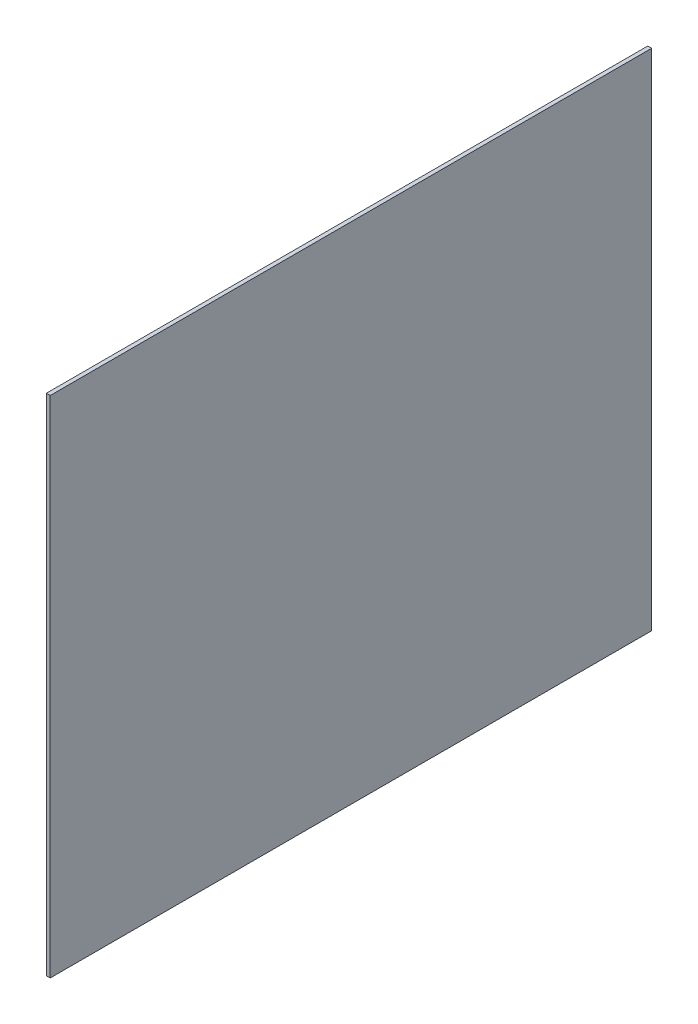
ISO-10303-21;
HEADER;
FILE_DESCRIPTION(('STEP AP214'),'2;1');
FILE_NAME('part.step','',(''),(''),'','','');
FILE_SCHEMA(('AUTOMOTIVE_DESIGN { 1 0 10303 214 1 1 1 1 }'));
ENDSEC;
DATA;
#1=APPLICATION_CONTEXT('core data for automotive mechanical design processes');
#2=APPLICATION_PROTOCOL_DEFINITION('international standard','automotive_design',2000,#1);
#3=PRODUCT_CONTEXT('',#1,'mechanical');
#4=PRODUCT('Part','Part','',(#3));
#5=PRODUCT_RELATED_PRODUCT_CATEGORY('part','',(#4));
#6=PRODUCT_DEFINITION_FORMATION('','',#4);
#7=PRODUCT_DEFINITION_CONTEXT('part definition',#1,'design');
#8=PRODUCT_DEFINITION('design','',#6,#7);
#9=PRODUCT_DEFINITION_SHAPE('','',#8);
#10=(LENGTH_UNIT() NAMED_UNIT(*) SI_UNIT(.MILLI.,.METRE.));
#11=(NAMED_UNIT(*) PLANE_ANGLE_UNIT() SI_UNIT($,.RADIAN.));
#12=(NAMED_UNIT(*) SI_UNIT($,.STERADIAN.) SOLID_ANGLE_UNIT());
#13=UNCERTAINTY_MEASURE_WITH_UNIT(LENGTH_MEASURE(1.E-05),#10,'distance_accuracy_value','');
#14=(GEOMETRIC_REPRESENTATION_CONTEXT(3) GLOBAL_UNCERTAINTY_ASSIGNED_CONTEXT((#13)) GLOBAL_UNIT_ASSIGNED_CONTEXT((#10,
#11,#12)) REPRESENTATION_CONTEXT('',''));
#15=CARTESIAN_POINT('',(0.,0.,0.));
#16=DIRECTION('',(0.,0.,1.));
#17=DIRECTION('',(1.,0.,0.));
#18=AXIS2_PLACEMENT_3D('',#15,#16,#17);
#19=CARTESIAN_POINT('',(0.,110.,0.));
#20=DIRECTION('',(0.,1.,0.));
#21=DIRECTION('',(0.,0.,1.));
#22=AXIS2_PLACEMENT_3D('',#19,#20,#21);
#23=PLANE('',#22);
#24=DIRECTION('',(1.,0.,0.));
#25=VECTOR('',#24,1.);
#26=CARTESIAN_POINT('',(-4.11678075902175,110.,20.4041929242941));
#27=LINE('',#26,#25);
#28=CARTESIAN_POINT('',(-4.96678075902174,110.,20.4041929242941));
#29=VERTEX_POINT('',#28);
#30=CARTESIAN_POINT('',(-4.11678075902175,110.,20.4041929242941));
#31=VERTEX_POINT('',#30);
#32=EDGE_CURVE('E82',#29,#31,#27,.T.);
#33=ORIENTED_EDGE('',*,*,#32,.F.);
#34=DIRECTION('',(0.,0.,-1.));
#35=VECTOR('',#34,1.);
#36=CARTESIAN_POINT('',(-4.96678075902174,110.,20.4041929242941));
#37=LINE('',#36,#35);
#38=CARTESIAN_POINT('',(-4.96678075902175,110.,151.551989097112));
#39=VERTEX_POINT('',#38);
#40=EDGE_CURVE('E77',#39,#29,#37,.T.);
#41=ORIENTED_EDGE('',*,*,#40,.F.);
#42=DIRECTION('',(1.,0.,0.));
#43=VECTOR('',#42,1.);
#44=CARTESIAN_POINT('',(-4.96678075902175,110.,151.551989097112));
#45=LINE('',#44,#43);
#46=CARTESIAN_POINT('',(-4.11678075902175,110.,151.551989097112));
#47=VERTEX_POINT('',#46);
#48=EDGE_CURVE('E79',#39,#47,#45,.T.);
#49=ORIENTED_EDGE('',*,*,#48,.T.);
#50=DIRECTION('',(0.,0.,1.));
#51=VECTOR('',#50,1.);
#52=CARTESIAN_POINT('',(-4.11678075902175,110.,31.5519890971125));
#53=LINE('',#52,#51);
#54=EDGE_CURVE('E105',#31,#47,#53,.T.);
#55=ORIENTED_EDGE('',*,*,#54,.F.);
#56=EDGE_LOOP('',(#33,#41,#49,#55));
#57=FACE_BOUND('',#56,.T.);
#58=ADVANCED_FACE('F41',(#57),#23,.T.);
#59=CARTESIAN_POINT('',(0.,0.,0.));
#60=DIRECTION('',(0.,1.,0.));
#61=DIRECTION('',(0.,0.,1.));
#62=AXIS2_PLACEMENT_3D('',#59,#60,#61);
#63=PLANE('',#62);
#64=DIRECTION('',(0.,0.,-1.));
#65=VECTOR('',#64,1.);
#66=CARTESIAN_POINT('',(-4.96678075902174,0.,21.5519890971125));
#67=LINE('',#66,#65);
#68=CARTESIAN_POINT('',(-4.96678075902175,0.,151.551989097112));
#69=VERTEX_POINT('',#68);
#70=CARTESIAN_POINT('',(-4.96678075902174,0.,20.4041929242941));
#71=VERTEX_POINT('',#70);
#72=EDGE_CURVE('E86',#69,#71,#67,.T.);
#73=ORIENTED_EDGE('',*,*,#72,.T.);
#74=DIRECTION('',(1.,0.,0.));
#75=VECTOR('',#74,1.);
#76=CARTESIAN_POINT('',(-4.11678075902175,0.,20.4041929242941));
#77=LINE('',#76,#75);
#78=CARTESIAN_POINT('',(-4.11678075902175,0.,20.4041929242941));
#79=VERTEX_POINT('',#78);
#80=EDGE_CURVE('E102',#71,#79,#77,.T.);
#81=ORIENTED_EDGE('',*,*,#80,.T.);
#82=DIRECTION('',(0.,0.,1.));
#83=VECTOR('',#82,1.);
#84=CARTESIAN_POINT('',(-4.11678075902175,0.,101.551989097112));
#85=LINE('',#84,#83);
#86=CARTESIAN_POINT('',(-4.11678075902175,0.,151.551989097112));
#87=VERTEX_POINT('',#86);
#88=EDGE_CURVE('E109',#79,#87,#85,.T.);
#89=ORIENTED_EDGE('',*,*,#88,.T.);
#90=DIRECTION('',(1.,0.,0.));
#91=VECTOR('',#90,1.);
#92=CARTESIAN_POINT('',(-4.96678075902175,0.,151.551989097112));
#93=LINE('',#92,#91);
#94=EDGE_CURVE('E95',#69,#87,#93,.T.);
#95=ORIENTED_EDGE('',*,*,#94,.F.);
#96=EDGE_LOOP('',(#73,#81,#89,#95));
#97=FACE_BOUND('',#96,.T.);
#98=ADVANCED_FACE('F43',(#97),#63,.F.);
#99=CARTESIAN_POINT('',(-4.96678075902174,110.,21.5519890971125));
#100=DIRECTION('',(-1.,0.,0.));
#101=DIRECTION('',(0.,0.,1.));
#102=AXIS2_PLACEMENT_3D('',#99,#100,#101);
#103=PLANE('',#102);
#104=ORIENTED_EDGE('',*,*,#40,.T.);
#105=DIRECTION('',(0.,-1.,0.));
#106=VECTOR('',#105,1.);
#107=CARTESIAN_POINT('',(-4.96678075902174,110.,20.4041929242941));
#108=LINE('',#107,#106);
#109=EDGE_CURVE('E11',#29,#71,#108,.T.);
#110=ORIENTED_EDGE('',*,*,#109,.T.);
#111=ORIENTED_EDGE('',*,*,#72,.F.);
#112=DIRECTION('',(0.,-1.,0.));
#113=VECTOR('',#112,1.);
#114=CARTESIAN_POINT('',(-4.96678075902175,110.,151.551989097112));
#115=LINE('',#114,#113);
#116=EDGE_CURVE('E92',#39,#69,#115,.T.);
#117=ORIENTED_EDGE('',*,*,#116,.F.);
#118=EDGE_LOOP('',(#104,#110,#111,#117));
#119=FACE_BOUND('',#118,.T.);
#120=ADVANCED_FACE('F97',(#119),#103,.T.);
#121=CARTESIAN_POINT('',(-4.11678075902175,110.,101.551989097112));
#122=DIRECTION('',(1.,0.,0.));
#123=DIRECTION('',(0.,0.,-1.));
#124=AXIS2_PLACEMENT_3D('',#121,#122,#123);
#125=PLANE('',#124);
#126=ORIENTED_EDGE('',*,*,#54,.T.);
#127=DIRECTION('',(0.,-1.,0.));
#128=VECTOR('',#127,1.);
#129=CARTESIAN_POINT('',(-4.11678075902175,110.,151.551989097112));
#130=LINE('',#129,#128);
#131=EDGE_CURVE('E94',#47,#87,#130,.T.);
#132=ORIENTED_EDGE('',*,*,#131,.T.);
#133=ORIENTED_EDGE('',*,*,#88,.F.);
#134=DIRECTION('',(0.,-1.,0.));
#135=VECTOR('',#134,1.);
#136=CARTESIAN_POINT('',(-4.11678075902175,110.,20.4041929242941));
#137=LINE('',#136,#135);
#138=EDGE_CURVE('E50',#31,#79,#137,.T.);
#139=ORIENTED_EDGE('',*,*,#138,.F.);
#140=EDGE_LOOP('',(#126,#132,#133,#139));
#141=FACE_BOUND('',#140,.T.);
#142=ADVANCED_FACE('F115',(#141),#125,.T.);
#143=CARTESIAN_POINT('',(-4.11678075902175,110.,20.4041929242941));
#144=DIRECTION('',(0.,0.,-1.));
#145=DIRECTION('',(-1.,0.,0.));
#146=AXIS2_PLACEMENT_3D('',#143,#144,#145);
#147=PLANE('',#146);
#148=ORIENTED_EDGE('',*,*,#80,.F.);
#149=ORIENTED_EDGE('',*,*,#109,.F.);
#150=ORIENTED_EDGE('',*,*,#32,.T.);
#151=ORIENTED_EDGE('',*,*,#138,.T.);
#152=EDGE_LOOP('',(#148,#149,#150,#151));
#153=FACE_BOUND('',#152,.T.);
#154=ADVANCED_FACE('F113',(#153),#147,.T.);
#155=CARTESIAN_POINT('',(-4.96678075902175,110.,151.551989097112));
#156=DIRECTION('',(0.,0.,1.));
#157=DIRECTION('',(1.,0.,0.));
#158=AXIS2_PLACEMENT_3D('',#155,#156,#157);
#159=PLANE('',#158);
#160=ORIENTED_EDGE('',*,*,#131,.F.);
#161=ORIENTED_EDGE('',*,*,#48,.F.);
#162=ORIENTED_EDGE('',*,*,#116,.T.);
#163=ORIENTED_EDGE('',*,*,#94,.T.);
#164=EDGE_LOOP('',(#160,#161,#162,#163));
#165=FACE_BOUND('',#164,.T.);
#166=ADVANCED_FACE('F90',(#165),#159,.T.);
#167=CLOSED_SHELL('',(#58,#98,#120,#142,#154,#166));
#168=MANIFOLD_SOLID_BREP('B2',#167);
#169=ADVANCED_BREP_SHAPE_REPRESENTATION('',(#18,#168),#14);
#170=SHAPE_DEFINITION_REPRESENTATION(#9,#169);
ENDSEC;
END-ISO-10303-21;
